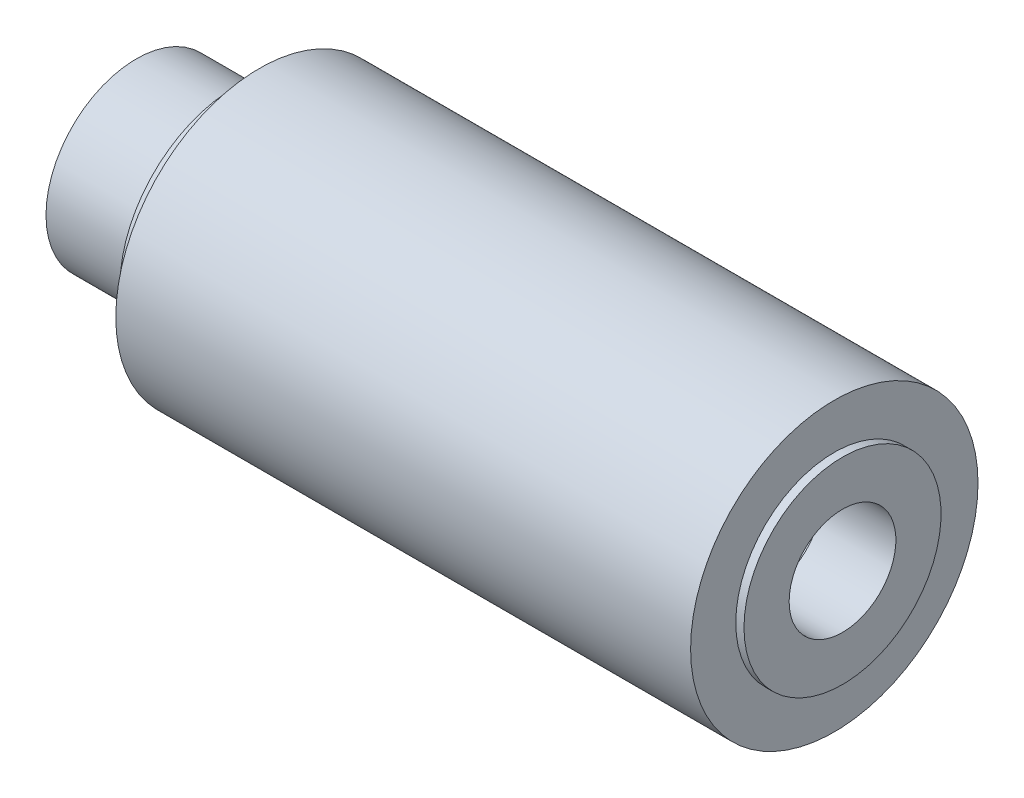
ISO-10303-21;
HEADER;
FILE_DESCRIPTION(('STEP AP214'),'2;1');
FILE_NAME('part.step','',(''),(''),'','','');
FILE_SCHEMA(('AUTOMOTIVE_DESIGN { 1 0 10303 214 1 1 1 1 }'));
ENDSEC;
DATA;
#1=APPLICATION_CONTEXT('core data for automotive mechanical design processes');
#2=APPLICATION_PROTOCOL_DEFINITION('international standard','automotive_design',2000,#1);
#3=PRODUCT_CONTEXT('',#1,'mechanical');
#4=PRODUCT('Part','Part','',(#3));
#5=PRODUCT_RELATED_PRODUCT_CATEGORY('part','',(#4));
#6=PRODUCT_DEFINITION_FORMATION('','',#4);
#7=PRODUCT_DEFINITION_CONTEXT('part definition',#1,'design');
#8=PRODUCT_DEFINITION('design','',#6,#7);
#9=PRODUCT_DEFINITION_SHAPE('','',#8);
#10=(LENGTH_UNIT() NAMED_UNIT(*) SI_UNIT(.MILLI.,.METRE.));
#11=(NAMED_UNIT(*) PLANE_ANGLE_UNIT() SI_UNIT($,.RADIAN.));
#12=(NAMED_UNIT(*) SI_UNIT($,.STERADIAN.) SOLID_ANGLE_UNIT());
#13=UNCERTAINTY_MEASURE_WITH_UNIT(LENGTH_MEASURE(1.E-05),#10,'distance_accuracy_value','');
#14=(GEOMETRIC_REPRESENTATION_CONTEXT(3) GLOBAL_UNCERTAINTY_ASSIGNED_CONTEXT((#13)) GLOBAL_UNIT_ASSIGNED_CONTEXT((#10,
#11,#12)) REPRESENTATION_CONTEXT('',''));
#15=CARTESIAN_POINT('',(0.,0.,0.));
#16=DIRECTION('',(0.,0.,1.));
#17=DIRECTION('',(1.,0.,0.));
#18=AXIS2_PLACEMENT_3D('',#15,#16,#17);
#19=CARTESIAN_POINT('',(-66.,-2.6547809049897,-16.761626960009));
#20=DIRECTION('',(1.,0.,0.));
#21=DIRECTION('',(0.,0.809016994374948,0.587785252292472));
#22=AXIS2_PLACEMENT_3D('',#19,#20,#21);
#23=PLANE('',#22);
#24=CARTESIAN_POINT('',(-66.,0.,0.));
#25=DIRECTION('',(-1.,0.,0.));
#26=DIRECTION('',(0.,0.,1.));
#27=AXIS2_PLACEMENT_3D('',#24,#25,#26);
#28=CIRCLE('',#27,12.);
#29=CARTESIAN_POINT('',(-66.,0.,12.));
#30=VERTEX_POINT('',#29);
#31=EDGE_CURVE('E77',#30,#30,#28,.T.);
#32=ORIENTED_EDGE('',*,*,#31,.F.);
#33=EDGE_LOOP('',(#32));
#34=FACE_BOUND('',#33,.T.);
#35=ADVANCED_FACE('F15',(#34),#23,.T.);
#36=CARTESIAN_POINT('',(-8.,0.,0.));
#37=DIRECTION('',(-1.,0.,0.));
#38=DIRECTION('',(0.,0.,1.));
#39=AXIS2_PLACEMENT_3D('',#36,#37,#38);
#40=CYLINDRICAL_SURFACE('',#39,12.);
#41=ORIENTED_EDGE('',*,*,#31,.T.);
#42=EDGE_LOOP('',(#41));
#43=FACE_BOUND('',#42,.T.);
#44=CARTESIAN_POINT('',(-8.,0.,0.));
#45=DIRECTION('',(-1.,0.,0.));
#46=DIRECTION('',(0.,0.,1.));
#47=AXIS2_PLACEMENT_3D('',#44,#45,#46);
#48=CIRCLE('',#47,12.);
#49=CARTESIAN_POINT('',(-8.,0.,12.));
#50=VERTEX_POINT('',#49);
#51=EDGE_CURVE('E72',#50,#50,#48,.T.);
#52=ORIENTED_EDGE('',*,*,#51,.F.);
#53=EDGE_LOOP('',(#52));
#54=FACE_BOUND('',#53,.T.);
#55=ADVANCED_FACE('F82',(#43,#54),#40,.F.);
#56=CARTESIAN_POINT('',(-85.,-15.364824713342,2.4335491629072));
#57=DIRECTION('',(-1.,0.,0.));
#58=DIRECTION('',(0.,0.809016994374945,0.587785252292477));
#59=AXIS2_PLACEMENT_3D('',#56,#57,#58);
#60=PLANE('',#59);
#61=CARTESIAN_POINT('',(-85.,0.,0.));
#62=DIRECTION('',(-1.,0.,0.));
#63=DIRECTION('',(0.,0.,1.));
#64=AXIS2_PLACEMENT_3D('',#61,#62,#63);
#65=CIRCLE('',#64,11.);
#66=CARTESIAN_POINT('',(-85.,0.,11.));
#67=VERTEX_POINT('',#66);
#68=EDGE_CURVE('E67',#67,#67,#65,.T.);
#69=ORIENTED_EDGE('',*,*,#68,.T.);
#70=EDGE_LOOP('',(#69));
#71=FACE_BOUND('',#70,.T.);
#72=ADVANCED_FACE('F91',(#71),#60,.T.);
#73=CARTESIAN_POINT('',(-8.,-16.761626960009,2.6547809049897));
#74=DIRECTION('',(-1.,0.,0.));
#75=DIRECTION('',(0.,0.809016994374948,0.587785252292472));
#76=AXIS2_PLACEMENT_3D('',#73,#74,#75);
#77=PLANE('',#76);
#78=CARTESIAN_POINT('',(-8.,0.,0.));
#79=DIRECTION('',(-1.,0.,0.));
#80=DIRECTION('',(0.,0.,1.));
#81=AXIS2_PLACEMENT_3D('',#78,#79,#80);
#82=CIRCLE('',#81,6.50000000000005);
#83=CARTESIAN_POINT('',(-8.,0.,6.50000000000005));
#84=VERTEX_POINT('',#83);
#85=EDGE_CURVE('E62',#84,#84,#82,.T.);
#86=ORIENTED_EDGE('',*,*,#85,.F.);
#87=EDGE_LOOP('',(#86));
#88=FACE_BOUND('',#87,.T.);
#89=ORIENTED_EDGE('',*,*,#51,.T.);
#90=EDGE_LOOP('',(#89));
#91=FACE_BOUND('',#90,.T.);
#92=ADVANCED_FACE('F121',(#88,#91),#77,.T.);
#93=CARTESIAN_POINT('',(-73.,0.,0.));
#94=DIRECTION('',(-1.,0.,0.));
#95=DIRECTION('',(0.,0.,1.));
#96=AXIS2_PLACEMENT_3D('',#93,#94,#95);
#97=CYLINDRICAL_SURFACE('',#96,11.);
#98=CARTESIAN_POINT('',(-73.,0.,0.));
#99=DIRECTION('',(-1.,0.,0.));
#100=DIRECTION('',(0.,0.,1.));
#101=AXIS2_PLACEMENT_3D('',#98,#99,#100);
#102=CIRCLE('',#101,11.);
#103=CARTESIAN_POINT('',(-73.,0.,11.));
#104=VERTEX_POINT('',#103);
#105=EDGE_CURVE('E57',#104,#104,#102,.F.);
#106=ORIENTED_EDGE('',*,*,#105,.F.);
#107=EDGE_LOOP('',(#106));
#108=FACE_BOUND('',#107,.T.);
#109=ORIENTED_EDGE('',*,*,#68,.F.);
#110=EDGE_LOOP('',(#109));
#111=FACE_BOUND('',#110,.T.);
#112=ADVANCED_FACE('F118',(#108,#111),#97,.T.);
#113=CARTESIAN_POINT('',(1.,0.,0.));
#114=DIRECTION('',(-1.,0.,0.));
#115=DIRECTION('',(0.,0.,1.));
#116=AXIS2_PLACEMENT_3D('',#113,#114,#115);
#117=CYLINDRICAL_SURFACE('',#116,6.50000000000005);
#118=ORIENTED_EDGE('',*,*,#85,.T.);
#119=EDGE_LOOP('',(#118));
#120=FACE_BOUND('',#119,.T.);
#121=CARTESIAN_POINT('',(1.,0.,0.));
#122=DIRECTION('',(-1.,0.,0.));
#123=DIRECTION('',(0.,0.,1.));
#124=AXIS2_PLACEMENT_3D('',#121,#122,#123);
#125=CIRCLE('',#124,6.50000000000005);
#126=CARTESIAN_POINT('',(1.,0.,6.50000000000005));
#127=VERTEX_POINT('',#126);
#128=EDGE_CURVE('E52',#127,#127,#125,.T.);
#129=ORIENTED_EDGE('',*,*,#128,.F.);
#130=EDGE_LOOP('',(#129));
#131=FACE_BOUND('',#130,.T.);
#132=ADVANCED_FACE('F114',(#120,#131),#117,.F.);
#133=CARTESIAN_POINT('',(-73.,-19.555231453344,3.0972443891546));
#134=DIRECTION('',(-1.,0.,0.));
#135=DIRECTION('',(0.,0.809016994374946,0.587785252292476));
#136=AXIS2_PLACEMENT_3D('',#133,#134,#135);
#137=PLANE('',#136);
#138=ORIENTED_EDGE('',*,*,#105,.T.);
#139=EDGE_LOOP('',(#138));
#140=FACE_BOUND('',#139,.T.);
#141=CARTESIAN_POINT('',(-73.,0.,0.));
#142=DIRECTION('',(-1.,0.,0.));
#143=DIRECTION('',(0.,0.,1.));
#144=AXIS2_PLACEMENT_3D('',#141,#142,#143);
#145=CIRCLE('',#144,13.9999999999998);
#146=CARTESIAN_POINT('',(-73.,0.,13.9999999999998));
#147=VERTEX_POINT('',#146);
#148=EDGE_CURVE('E47',#147,#147,#145,.T.);
#149=ORIENTED_EDGE('',*,*,#148,.T.);
#150=EDGE_LOOP('',(#149));
#151=FACE_BOUND('',#150,.T.);
#152=ADVANCED_FACE('F117',(#140,#151),#137,.T.);
#153=CARTESIAN_POINT('',(1.,-2.6547809049897,-16.761626960009));
#154=DIRECTION('',(1.,0.,0.));
#155=DIRECTION('',(0.,0.809016994374948,0.587785252292472));
#156=AXIS2_PLACEMENT_3D('',#153,#154,#155);
#157=PLANE('',#156);
#158=ORIENTED_EDGE('',*,*,#128,.T.);
#159=EDGE_LOOP('',(#158));
#160=FACE_BOUND('',#159,.T.);
#161=CARTESIAN_POINT('',(1.,0.,0.));
#162=DIRECTION('',(-1.,0.,0.));
#163=DIRECTION('',(0.,0.,1.));
#164=AXIS2_PLACEMENT_3D('',#161,#162,#163);
#165=CIRCLE('',#164,12.);
#166=CARTESIAN_POINT('',(1.,0.,12.));
#167=VERTEX_POINT('',#166);
#168=EDGE_CURVE('E42',#167,#167,#165,.F.);
#169=ORIENTED_EDGE('',*,*,#168,.T.);
#170=EDGE_LOOP('',(#169));
#171=FACE_BOUND('',#170,.T.);
#172=ADVANCED_FACE('F112',(#160,#171),#157,.T.);
#173=CARTESIAN_POINT('',(-70.,0.,0.));
#174=DIRECTION('',(-1.,0.,0.));
#175=DIRECTION('',(0.,0.,1.));
#176=AXIS2_PLACEMENT_3D('',#173,#174,#175);
#177=CYLINDRICAL_SURFACE('',#176,13.9999999999998);
#178=CARTESIAN_POINT('',(-70.,0.,0.));
#179=DIRECTION('',(-1.,0.,0.));
#180=DIRECTION('',(0.,0.,1.));
#181=AXIS2_PLACEMENT_3D('',#178,#179,#180);
#182=CIRCLE('',#181,13.9999999999998);
#183=CARTESIAN_POINT('',(-70.,0.,13.9999999999998));
#184=VERTEX_POINT('',#183);
#185=EDGE_CURVE('E37',#184,#184,#182,.F.);
#186=ORIENTED_EDGE('',*,*,#185,.F.);
#187=EDGE_LOOP('',(#186));
#188=FACE_BOUND('',#187,.T.);
#189=ORIENTED_EDGE('',*,*,#148,.F.);
#190=EDGE_LOOP('',(#189));
#191=FACE_BOUND('',#190,.T.);
#192=ADVANCED_FACE('F108',(#188,#191),#177,.T.);
#193=CARTESIAN_POINT('',(1.,0.,0.));
#194=DIRECTION('',(-1.,0.,0.));
#195=DIRECTION('',(0.,0.,1.));
#196=AXIS2_PLACEMENT_3D('',#193,#194,#195);
#197=CYLINDRICAL_SURFACE('',#196,12.);
#198=ORIENTED_EDGE('',*,*,#168,.F.);
#199=EDGE_LOOP('',(#198));
#200=FACE_BOUND('',#199,.T.);
#201=CARTESIAN_POINT('',(0.,0.,0.));
#202=DIRECTION('',(-1.,0.,0.));
#203=DIRECTION('',(0.,0.,1.));
#204=AXIS2_PLACEMENT_3D('',#201,#202,#203);
#205=CIRCLE('',#204,12.);
#206=CARTESIAN_POINT('',(0.,0.,12.));
#207=VERTEX_POINT('',#206);
#208=EDGE_CURVE('E28',#207,#207,#205,.T.);
#209=ORIENTED_EDGE('',*,*,#208,.F.);
#210=EDGE_LOOP('',(#209));
#211=FACE_BOUND('',#210,.T.);
#212=ADVANCED_FACE('F105',(#200,#211),#197,.T.);
#213=CARTESIAN_POINT('',(-70.,-24.44403931668,3.8715554864433));
#214=DIRECTION('',(-1.,0.,0.));
#215=DIRECTION('',(0.,0.809016994374947,0.587785252292474));
#216=AXIS2_PLACEMENT_3D('',#213,#214,#215);
#217=PLANE('',#216);
#218=ORIENTED_EDGE('',*,*,#185,.T.);
#219=EDGE_LOOP('',(#218));
#220=FACE_BOUND('',#219,.T.);
#221=CARTESIAN_POINT('',(-70.,0.,0.));
#222=DIRECTION('',(-1.,0.,0.));
#223=DIRECTION('',(0.,0.,1.));
#224=AXIS2_PLACEMENT_3D('',#221,#222,#223);
#225=CIRCLE('',#224,17.5000000000002);
#226=CARTESIAN_POINT('',(-70.,0.,17.5000000000002));
#227=VERTEX_POINT('',#226);
#228=EDGE_CURVE('E23',#227,#227,#225,.T.);
#229=ORIENTED_EDGE('',*,*,#228,.T.);
#230=EDGE_LOOP('',(#229));
#231=FACE_BOUND('',#230,.T.);
#232=ADVANCED_FACE('F101',(#220,#231),#217,.T.);
#233=CARTESIAN_POINT('',(0.,-3.8715554864433,-24.44403931668));
#234=DIRECTION('',(1.,0.,0.));
#235=DIRECTION('',(0.,0.809016994374947,0.587785252292474));
#236=AXIS2_PLACEMENT_3D('',#233,#234,#235);
#237=PLANE('',#236);
#238=ORIENTED_EDGE('',*,*,#208,.T.);
#239=EDGE_LOOP('',(#238));
#240=FACE_BOUND('',#239,.T.);
#241=CARTESIAN_POINT('',(0.,0.,0.));
#242=DIRECTION('',(-1.,0.,0.));
#243=DIRECTION('',(0.,0.,1.));
#244=AXIS2_PLACEMENT_3D('',#241,#242,#243);
#245=CIRCLE('',#244,17.5000000000002);
#246=CARTESIAN_POINT('',(0.,0.,17.5000000000002));
#247=VERTEX_POINT('',#246);
#248=EDGE_CURVE('E10',#247,#247,#245,.F.);
#249=ORIENTED_EDGE('',*,*,#248,.T.);
#250=EDGE_LOOP('',(#249));
#251=FACE_BOUND('',#250,.T.);
#252=ADVANCED_FACE('F17',(#240,#251),#237,.T.);
#253=CARTESIAN_POINT('',(0.,0.,0.));
#254=DIRECTION('',(-1.,0.,0.));
#255=DIRECTION('',(0.,0.,1.));
#256=AXIS2_PLACEMENT_3D('',#253,#254,#255);
#257=CYLINDRICAL_SURFACE('',#256,17.5000000000002);
#258=ORIENTED_EDGE('',*,*,#248,.F.);
#259=EDGE_LOOP('',(#258));
#260=FACE_BOUND('',#259,.T.);
#261=ORIENTED_EDGE('',*,*,#228,.F.);
#262=EDGE_LOOP('',(#261));
#263=FACE_BOUND('',#262,.T.);
#264=ADVANCED_FACE('F95',(#260,#263),#257,.T.);
#265=CLOSED_SHELL('',(#35,#55,#72,#92,#112,#132,#152,#172,#192,#212,#232,#252,#264));
#266=MANIFOLD_SOLID_BREP('B1',#265);
#267=ADVANCED_BREP_SHAPE_REPRESENTATION('',(#18,#266),#14);
#268=SHAPE_DEFINITION_REPRESENTATION(#9,#267);
ENDSEC;
END-ISO-10303-21;
